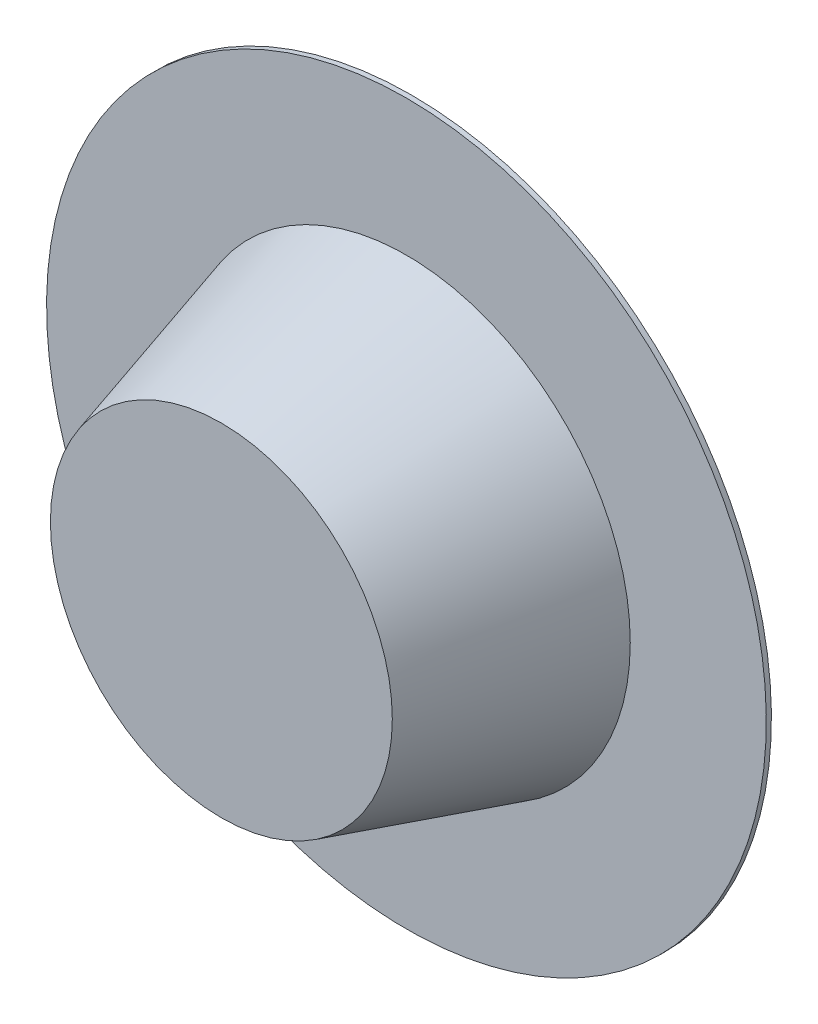
ISO-10303-21;
HEADER;
FILE_DESCRIPTION(('STEP AP214'),'2;1');
FILE_NAME('part.step','',(''),(''),'','','');
FILE_SCHEMA(('AUTOMOTIVE_DESIGN { 1 0 10303 214 1 1 1 1 }'));
ENDSEC;
DATA;
#1=APPLICATION_CONTEXT('core data for automotive mechanical design processes');
#2=APPLICATION_PROTOCOL_DEFINITION('international standard','automotive_design',2000,#1);
#3=PRODUCT_CONTEXT('',#1,'mechanical');
#4=PRODUCT('Part','Part','',(#3));
#5=PRODUCT_RELATED_PRODUCT_CATEGORY('part','',(#4));
#6=PRODUCT_DEFINITION_FORMATION('','',#4);
#7=PRODUCT_DEFINITION_CONTEXT('part definition',#1,'design');
#8=PRODUCT_DEFINITION('design','',#6,#7);
#9=PRODUCT_DEFINITION_SHAPE('','',#8);
#10=(LENGTH_UNIT() NAMED_UNIT(*) SI_UNIT(.MILLI.,.METRE.));
#11=(NAMED_UNIT(*) PLANE_ANGLE_UNIT() SI_UNIT($,.RADIAN.));
#12=(NAMED_UNIT(*) SI_UNIT($,.STERADIAN.) SOLID_ANGLE_UNIT());
#13=UNCERTAINTY_MEASURE_WITH_UNIT(LENGTH_MEASURE(1.E-05),#10,'distance_accuracy_value','');
#14=(GEOMETRIC_REPRESENTATION_CONTEXT(3) GLOBAL_UNCERTAINTY_ASSIGNED_CONTEXT((#13)) GLOBAL_UNIT_ASSIGNED_CONTEXT((#10,
#11,#12)) REPRESENTATION_CONTEXT('',''));
#15=CARTESIAN_POINT('',(0.,0.,0.));
#16=DIRECTION('',(0.,0.,1.));
#17=DIRECTION('',(1.,0.,0.));
#18=AXIS2_PLACEMENT_3D('',#15,#16,#17);
#19=CARTESIAN_POINT('',(3.51902257734992E-13,1.75951128867496E-13,2873.5));
#20=DIRECTION('',(0.,0.,-1.));
#21=DIRECTION('',(0.,1.,0.));
#22=AXIS2_PLACEMENT_3D('',#19,#20,#21);
#23=PLANE('',#22);
#24=CARTESIAN_POINT('',(-9.1012780255326E-10,3.71023771368181E-10,2873.49999999946));
#25=DIRECTION('',(0.,0.,-1.));
#26=DIRECTION('',(-1.,0.,0.));
#27=AXIS2_PLACEMENT_3D('',#24,#25,#26);
#28=CIRCLE('',#27,66.5086028246265);
#29=CARTESIAN_POINT('',(-66.5086028255366,3.71035988800316E-10,2873.49999999946));
#30=VERTEX_POINT('',#29);
#31=EDGE_CURVE('E48',#30,#30,#28,.F.);
#32=ORIENTED_EDGE('',*,*,#31,.T.);
#33=EDGE_LOOP('',(#32));
#34=FACE_BOUND('',#33,.T.);
#35=ADVANCED_FACE('F16',(#34),#23,.F.);
#36=CARTESIAN_POINT('',(-1.02049312075895E-09,3.1398301310224E-10,-1370532.61367841));
#37=DIRECTION('',(0.,0.,-1.));
#38=DIRECTION('',(-1.,0.,0.));
#39=AXIS2_PLACEMENT_3D('',#36,#37,#38);
#40=CONICAL_SURFACE('',#39,392468.25536811,0.27829965900513);
#41=ORIENTED_EDGE('',*,*,#31,.F.);
#42=EDGE_LOOP('',(#41));
#43=FACE_BOUND('',#42,.T.);
#44=CARTESIAN_POINT('',(-9.10133588389533E-10,3.71020781040299E-10,2801.50000000004));
#45=DIRECTION('',(0.,0.,-1.));
#46=DIRECTION('',(-1.,0.,0.));
#47=AXIS2_PLACEMENT_3D('',#44,#45,#46);
#48=CIRCLE('',#47,87.0800313958853);
#49=CARTESIAN_POINT('',(-87.0800313967954,3.71036777382557E-10,2801.50000000004));
#50=VERTEX_POINT('',#49);
#51=EDGE_CURVE('E44',#50,#50,#48,.F.);
#52=ORIENTED_EDGE('',*,*,#51,.T.);
#53=EDGE_LOOP('',(#52));
#54=FACE_BOUND('',#53,.T.);
#55=ADVANCED_FACE('F55',(#43,#54),#40,.T.);
#56=CARTESIAN_POINT('',(3.51657328375163E-13,1.75828664187581E-13,2871.5));
#57=DIRECTION('',(0.,0.,-1.));
#58=DIRECTION('',(0.,1.,0.));
#59=AXIS2_PLACEMENT_3D('',#56,#57,#58);
#60=PLANE('',#59);
#61=CARTESIAN_POINT('',(1.60745513518422E-09,-2.10756946650427E-10,2871.5));
#62=DIRECTION('',(0.,0.,-1.));
#63=DIRECTION('',(-1.,0.,0.));
#64=AXIS2_PLACEMENT_3D('',#61,#62,#63);
#65=CIRCLE('',#64,64.9999999984061);
#66=CARTESIAN_POINT('',(-64.9999999967986,-2.10745006344136E-10,2871.5));
#67=VERTEX_POINT('',#66);
#68=EDGE_CURVE('E40',#67,#67,#65,.F.);
#69=ORIENTED_EDGE('',*,*,#68,.F.);
#70=EDGE_LOOP('',(#69));
#71=FACE_BOUND('',#70,.T.);
#72=ADVANCED_FACE('F58',(#71),#60,.T.);
#73=CARTESIAN_POINT('',(3.43084800781131E-13,1.71542400390565E-13,2801.5));
#74=DIRECTION('',(0.,0.,-1.));
#75=DIRECTION('',(0.,1.,0.));
#76=AXIS2_PLACEMENT_3D('',#73,#74,#75);
#77=PLANE('',#76);
#78=ORIENTED_EDGE('',*,*,#51,.F.);
#79=EDGE_LOOP('',(#78));
#80=FACE_BOUND('',#79,.T.);
#81=CARTESIAN_POINT('',(3.56962588588894E-13,1.43786824774911E-13,2801.49999999958));
#82=DIRECTION('',(0.,0.,-1.));
#83=DIRECTION('',(0.,1.,0.));
#84=AXIS2_PLACEMENT_3D('',#81,#82,#83);
#85=CIRCLE('',#84,140.);
#86=CARTESIAN_POINT('',(3.82680171370988E-13,140.,2801.49999999958));
#87=VERTEX_POINT('',#86);
#88=EDGE_CURVE('E36',#87,#87,#85,.F.);
#89=ORIENTED_EDGE('',*,*,#88,.T.);
#90=EDGE_LOOP('',(#89));
#91=FACE_BOUND('',#90,.T.);
#92=ADVANCED_FACE('F62',(#80,#91),#77,.F.);
#93=CARTESIAN_POINT('',(1.7648336042396E-09,-2.9708413924197E-10,-1370539.13948689));
#94=DIRECTION('',(0.,0.,-1.));
#95=DIRECTION('',(-1.,0.,0.));
#96=AXIS2_PLACEMENT_3D('',#93,#94,#95);
#97=CONICAL_SURFACE('',#96,392468.039853394,0.27829965900511);
#98=ORIENTED_EDGE('',*,*,#68,.T.);
#99=EDGE_LOOP('',(#98));
#100=FACE_BOUND('',#99,.T.);
#101=CARTESIAN_POINT('',(3.56962588588894E-13,1.75011847342493E-13,2801.49999999958));
#102=DIRECTION('',(0.,0.,1.));
#103=DIRECTION('',(0.,-1.,0.));
#104=AXIS2_PLACEMENT_3D('',#101,#102,#103);
#105=CIRCLE('',#104,85.);
#106=CARTESIAN_POINT('',(3.41348341899765E-13,-84.9999999999998,2801.49999999958));
#107=VERTEX_POINT('',#106);
#108=EDGE_CURVE('E31',#107,#107,#105,.T.);
#109=ORIENTED_EDGE('',*,*,#108,.F.);
#110=EDGE_LOOP('',(#109));
#111=FACE_BOUND('',#110,.T.);
#112=ADVANCED_FACE('F65',(#100,#111),#97,.F.);
#113=CARTESIAN_POINT('',(7.35145042077001E-10,3.67537826568981E-10,6002801.5));
#114=DIRECTION('',(0.,0.,-1.));
#115=DIRECTION('',(0.,1.,0.));
#116=AXIS2_PLACEMENT_3D('',#113,#114,#115);
#117=CYLINDRICAL_SURFACE('',#116,140.);
#118=CARTESIAN_POINT('',(3.35900977517404E-13,1.71419935710655E-13,2799.50000000008));
#119=DIRECTION('',(0.,0.,-1.));
#120=DIRECTION('',(0.,1.,0.));
#121=AXIS2_PLACEMENT_3D('',#118,#119,#120);
#122=CIRCLE('',#121,140.);
#123=CARTESIAN_POINT('',(3.61618560299498E-13,140.,2799.50000000008));
#124=VERTEX_POINT('',#123);
#125=EDGE_CURVE('E20',#124,#124,#122,.T.);
#126=ORIENTED_EDGE('',*,*,#125,.F.);
#127=EDGE_LOOP('',(#126));
#128=FACE_BOUND('',#127,.T.);
#129=ORIENTED_EDGE('',*,*,#88,.F.);
#130=EDGE_LOOP('',(#129));
#131=FACE_BOUND('',#130,.T.);
#132=ADVANCED_FACE('F69',(#128,#131),#117,.T.);
#133=CARTESIAN_POINT('',(-7.34431361829183E-10,-3.67219150361544E-10,-5997200.5));
#134=DIRECTION('',(0.,0.,1.));
#135=DIRECTION('',(0.,-1.,0.));
#136=AXIS2_PLACEMENT_3D('',#133,#134,#135);
#137=CYLINDRICAL_SURFACE('',#136,85.);
#138=CARTESIAN_POINT('',(3.28962083613497E-13,1.74889382662609E-13,2799.50000000008));
#139=DIRECTION('',(0.,0.,1.));
#140=DIRECTION('',(0.,-1.,0.));
#141=AXIS2_PLACEMENT_3D('',#138,#139,#140);
#142=CIRCLE('',#141,85.);
#143=CARTESIAN_POINT('',(3.13347836924368E-13,-84.9999999999998,2799.50000000008));
#144=VERTEX_POINT('',#143);
#145=EDGE_CURVE('E10',#144,#144,#142,.T.);
#146=ORIENTED_EDGE('',*,*,#145,.F.);
#147=EDGE_LOOP('',(#146));
#148=FACE_BOUND('',#147,.T.);
#149=ORIENTED_EDGE('',*,*,#108,.T.);
#150=EDGE_LOOP('',(#149));
#151=FACE_BOUND('',#150,.T.);
#152=ADVANCED_FACE('F71',(#148,#151),#137,.F.);
#153=CARTESIAN_POINT('',(3.42839871421302E-13,1.7141993571065E-13,2799.5));
#154=DIRECTION('',(0.,0.,-1.));
#155=DIRECTION('',(0.,1.,0.));
#156=AXIS2_PLACEMENT_3D('',#153,#154,#155);
#157=PLANE('',#156);
#158=ORIENTED_EDGE('',*,*,#145,.T.);
#159=EDGE_LOOP('',(#158));
#160=FACE_BOUND('',#159,.T.);
#161=ORIENTED_EDGE('',*,*,#125,.T.);
#162=EDGE_LOOP('',(#161));
#163=FACE_BOUND('',#162,.T.);
#164=ADVANCED_FACE('F18',(#160,#163),#157,.T.);
#165=CLOSED_SHELL('',(#35,#55,#72,#92,#112,#132,#152,#164));
#166=MANIFOLD_SOLID_BREP('B1',#165);
#167=ADVANCED_BREP_SHAPE_REPRESENTATION('',(#18,#166),#14);
#168=SHAPE_DEFINITION_REPRESENTATION(#9,#167);
ENDSEC;
END-ISO-10303-21;
